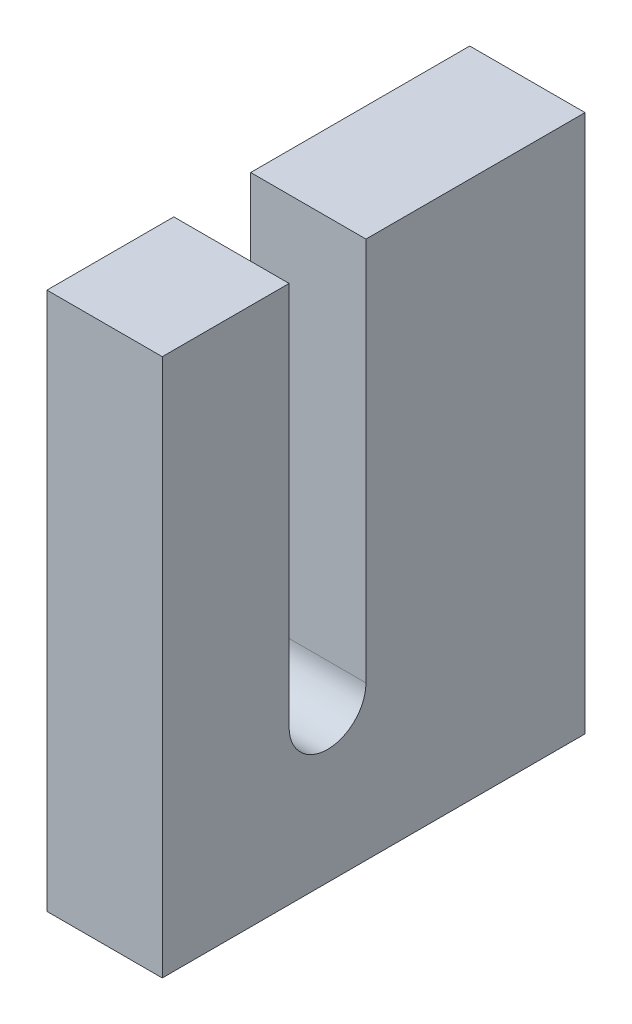
ISO-10303-21;
HEADER;
FILE_DESCRIPTION(('STEP AP214'),'2;1');
FILE_NAME('part.step','',(''),(''),'','','');
FILE_SCHEMA(('AUTOMOTIVE_DESIGN { 1 0 10303 214 1 1 1 1 }'));
ENDSEC;
DATA;
#1=APPLICATION_CONTEXT('core data for automotive mechanical design processes');
#2=APPLICATION_PROTOCOL_DEFINITION('international standard','automotive_design',2000,#1);
#3=PRODUCT_CONTEXT('',#1,'mechanical');
#4=PRODUCT('Part','Part','',(#3));
#5=PRODUCT_RELATED_PRODUCT_CATEGORY('part','',(#4));
#6=PRODUCT_DEFINITION_FORMATION('','',#4);
#7=PRODUCT_DEFINITION_CONTEXT('part definition',#1,'design');
#8=PRODUCT_DEFINITION('design','',#6,#7);
#9=PRODUCT_DEFINITION_SHAPE('','',#8);
#10=(LENGTH_UNIT() NAMED_UNIT(*) SI_UNIT(.MILLI.,.METRE.));
#11=(NAMED_UNIT(*) PLANE_ANGLE_UNIT() SI_UNIT($,.RADIAN.));
#12=(NAMED_UNIT(*) SI_UNIT($,.STERADIAN.) SOLID_ANGLE_UNIT());
#13=UNCERTAINTY_MEASURE_WITH_UNIT(LENGTH_MEASURE(1.E-05),#10,'distance_accuracy_value','');
#14=(GEOMETRIC_REPRESENTATION_CONTEXT(3) GLOBAL_UNCERTAINTY_ASSIGNED_CONTEXT((#13)) GLOBAL_UNIT_ASSIGNED_CONTEXT((#10,
#11,#12)) REPRESENTATION_CONTEXT('',''));
#15=CARTESIAN_POINT('',(0.,0.,0.));
#16=DIRECTION('',(0.,0.,1.));
#17=DIRECTION('',(1.,0.,0.));
#18=AXIS2_PLACEMENT_3D('',#15,#16,#17);
#19=CARTESIAN_POINT('',(7.5,70.,27.5));
#20=DIRECTION('',(-1.,0.,0.));
#21=DIRECTION('',(0.,0.,1.));
#22=AXIS2_PLACEMENT_3D('',#19,#20,#21);
#23=PLANE('',#22);
#24=DIRECTION('',(0.,1.,0.));
#25=VECTOR('',#24,1.);
#26=CARTESIAN_POINT('',(7.5,70.,1.00000000000001));
#27=LINE('',#26,#25);
#28=CARTESIAN_POINT('',(7.50000000000001,20.,1.00000000000001));
#29=VERTEX_POINT('',#28);
#30=CARTESIAN_POINT('',(7.50000000000001,70.,1.00000000000001));
#31=VERTEX_POINT('',#30);
#32=EDGE_CURVE('E132',#29,#31,#27,.T.);
#33=ORIENTED_EDGE('',*,*,#32,.F.);
#34=CARTESIAN_POINT('',(7.5,20.,6.00000000000001));
#35=DIRECTION('',(-1.,0.,0.));
#36=DIRECTION('',(0.,0.,1.));
#37=AXIS2_PLACEMENT_3D('',#34,#35,#36);
#38=CIRCLE('',#37,5.);
#39=CARTESIAN_POINT('',(7.50000000000001,20.,11.));
#40=VERTEX_POINT('',#39);
#41=EDGE_CURVE('E134',#29,#40,#38,.T.);
#42=ORIENTED_EDGE('',*,*,#41,.T.);
#43=DIRECTION('',(0.,1.,0.));
#44=VECTOR('',#43,1.);
#45=CARTESIAN_POINT('',(7.5,70.,11.));
#46=LINE('',#45,#44);
#47=CARTESIAN_POINT('',(7.50000000000001,70.,11.));
#48=VERTEX_POINT('',#47);
#49=EDGE_CURVE('E109',#40,#48,#46,.T.);
#50=ORIENTED_EDGE('',*,*,#49,.T.);
#51=DIRECTION('',(0.,0.,-1.));
#52=VECTOR('',#51,1.);
#53=CARTESIAN_POINT('',(7.5,70.,27.5));
#54=LINE('',#53,#52);
#55=CARTESIAN_POINT('',(7.5,70.,27.5));
#56=VERTEX_POINT('',#55);
#57=EDGE_CURVE('E137',#56,#48,#54,.T.);
#58=ORIENTED_EDGE('',*,*,#57,.F.);
#59=DIRECTION('',(0.,-1.,0.));
#60=VECTOR('',#59,1.);
#61=CARTESIAN_POINT('',(7.5,70.,27.5));
#62=LINE('',#61,#60);
#63=CARTESIAN_POINT('',(7.5,0.,27.5));
#64=VERTEX_POINT('',#63);
#65=EDGE_CURVE('E145',#56,#64,#62,.T.);
#66=ORIENTED_EDGE('',*,*,#65,.T.);
#67=DIRECTION('',(0.,0.,-1.));
#68=VECTOR('',#67,1.);
#69=CARTESIAN_POINT('',(7.5,0.,27.5));
#70=LINE('',#69,#68);
#71=CARTESIAN_POINT('',(7.50000000000001,0.,-27.5));
#72=VERTEX_POINT('',#71);
#73=EDGE_CURVE('E136',#64,#72,#70,.T.);
#74=ORIENTED_EDGE('',*,*,#73,.T.);
#75=DIRECTION('',(0.,-1.,0.));
#76=VECTOR('',#75,1.);
#77=CARTESIAN_POINT('',(7.50000000000001,70.,-27.5));
#78=LINE('',#77,#76);
#79=CARTESIAN_POINT('',(7.50000000000001,70.,-27.5));
#80=VERTEX_POINT('',#79);
#81=EDGE_CURVE('E159',#80,#72,#78,.T.);
#82=ORIENTED_EDGE('',*,*,#81,.F.);
#83=EDGE_CURVE('E85',#31,#80,#54,.T.);
#84=ORIENTED_EDGE('',*,*,#83,.F.);
#85=EDGE_LOOP('',(#33,#42,#50,#58,#66,#74,#82,#84));
#86=FACE_BOUND('',#85,.T.);
#87=ADVANCED_FACE('F33',(#86),#23,.F.);
#88=CARTESIAN_POINT('',(-7.49999999999999,70.,27.5));
#89=DIRECTION('',(1.,0.,0.));
#90=DIRECTION('',(0.,0.,-1.));
#91=AXIS2_PLACEMENT_3D('',#88,#89,#90);
#92=PLANE('',#91);
#93=DIRECTION('',(0.,1.,0.));
#94=VECTOR('',#93,1.);
#95=CARTESIAN_POINT('',(-7.49999999999999,0.,1.00000000000001));
#96=LINE('',#95,#94);
#97=CARTESIAN_POINT('',(-7.49999999999999,20.,1.00000000000001));
#98=VERTEX_POINT('',#97);
#99=CARTESIAN_POINT('',(-7.49999999999999,70.,1.00000000000001));
#100=VERTEX_POINT('',#99);
#101=EDGE_CURVE('E113',#98,#100,#96,.T.);
#102=ORIENTED_EDGE('',*,*,#101,.T.);
#103=DIRECTION('',(0.,0.,1.));
#104=VECTOR('',#103,1.);
#105=CARTESIAN_POINT('',(-7.49999999999999,70.,27.5));
#106=LINE('',#105,#104);
#107=CARTESIAN_POINT('',(-7.49999999999999,70.,-27.5));
#108=VERTEX_POINT('',#107);
#109=EDGE_CURVE('E141',#108,#100,#106,.T.);
#110=ORIENTED_EDGE('',*,*,#109,.F.);
#111=DIRECTION('',(0.,-1.,0.));
#112=VECTOR('',#111,1.);
#113=CARTESIAN_POINT('',(-7.49999999999999,70.,-27.5));
#114=LINE('',#113,#112);
#115=CARTESIAN_POINT('',(-7.49999999999999,0.,-27.5));
#116=VERTEX_POINT('',#115);
#117=EDGE_CURVE('E156',#108,#116,#114,.T.);
#118=ORIENTED_EDGE('',*,*,#117,.T.);
#119=DIRECTION('',(0.,0.,1.));
#120=VECTOR('',#119,1.);
#121=CARTESIAN_POINT('',(-7.49999999999999,0.,27.5));
#122=LINE('',#121,#120);
#123=CARTESIAN_POINT('',(-7.49999999999999,0.,27.5));
#124=VERTEX_POINT('',#123);
#125=EDGE_CURVE('E150',#116,#124,#122,.T.);
#126=ORIENTED_EDGE('',*,*,#125,.T.);
#127=DIRECTION('',(0.,-1.,0.));
#128=VECTOR('',#127,1.);
#129=CARTESIAN_POINT('',(-7.49999999999999,70.,27.5));
#130=LINE('',#129,#128);
#131=CARTESIAN_POINT('',(-7.49999999999999,70.,27.5));
#132=VERTEX_POINT('',#131);
#133=EDGE_CURVE('E154',#132,#124,#130,.T.);
#134=ORIENTED_EDGE('',*,*,#133,.F.);
#135=CARTESIAN_POINT('',(-7.49999999999999,70.,11.));
#136=VERTEX_POINT('',#135);
#137=EDGE_CURVE('E126',#136,#132,#106,.T.);
#138=ORIENTED_EDGE('',*,*,#137,.F.);
#139=DIRECTION('',(0.,1.,0.));
#140=VECTOR('',#139,1.);
#141=CARTESIAN_POINT('',(-7.49999999999999,0.,11.));
#142=LINE('',#141,#140);
#143=CARTESIAN_POINT('',(-7.49999999999999,20.,11.));
#144=VERTEX_POINT('',#143);
#145=EDGE_CURVE('E47',#144,#136,#142,.T.);
#146=ORIENTED_EDGE('',*,*,#145,.F.);
#147=CARTESIAN_POINT('',(-7.49999999999999,20.,6.00000000000001));
#148=DIRECTION('',(-1.,0.,0.));
#149=DIRECTION('',(0.,0.,1.));
#150=AXIS2_PLACEMENT_3D('',#147,#148,#149);
#151=CIRCLE('',#150,5.);
#152=EDGE_CURVE('E116',#98,#144,#151,.T.);
#153=ORIENTED_EDGE('',*,*,#152,.F.);
#154=EDGE_LOOP('',(#102,#110,#118,#126,#134,#138,#146,#153));
#155=FACE_BOUND('',#154,.T.);
#156=ADVANCED_FACE('F124',(#155),#92,.F.);
#157=CARTESIAN_POINT('',(0.,70.,0.));
#158=DIRECTION('',(0.,-1.,0.));
#159=DIRECTION('',(0.,0.,-1.));
#160=AXIS2_PLACEMENT_3D('',#157,#158,#159);
#161=PLANE('',#160);
#162=DIRECTION('',(-1.,0.,0.));
#163=VECTOR('',#162,1.);
#164=CARTESIAN_POINT('',(0.,70.,1.00000000000001));
#165=LINE('',#164,#163);
#166=EDGE_CURVE('E11',#31,#100,#165,.T.);
#167=ORIENTED_EDGE('',*,*,#166,.F.);
#168=ORIENTED_EDGE('',*,*,#83,.T.);
#169=DIRECTION('',(-1.,0.,0.));
#170=VECTOR('',#169,1.);
#171=CARTESIAN_POINT('',(-7.49999999999999,70.,-27.5));
#172=LINE('',#171,#170);
#173=EDGE_CURVE('E139',#80,#108,#172,.T.);
#174=ORIENTED_EDGE('',*,*,#173,.T.);
#175=ORIENTED_EDGE('',*,*,#109,.T.);
#176=EDGE_LOOP('',(#167,#168,#174,#175));
#177=FACE_BOUND('',#176,.T.);
#178=ADVANCED_FACE('F168',(#177),#161,.F.);
#179=CARTESIAN_POINT('',(-7.49999999999999,70.,-27.5));
#180=DIRECTION('',(0.,0.,1.));
#181=DIRECTION('',(1.,0.,0.));
#182=AXIS2_PLACEMENT_3D('',#179,#180,#181);
#183=PLANE('',#182);
#184=DIRECTION('',(-1.,0.,0.));
#185=VECTOR('',#184,1.);
#186=CARTESIAN_POINT('',(-7.49999999999999,0.,-27.5));
#187=LINE('',#186,#185);
#188=EDGE_CURVE('E148',#72,#116,#187,.T.);
#189=ORIENTED_EDGE('',*,*,#188,.T.);
#190=ORIENTED_EDGE('',*,*,#117,.F.);
#191=ORIENTED_EDGE('',*,*,#173,.F.);
#192=ORIENTED_EDGE('',*,*,#81,.T.);
#193=EDGE_LOOP('',(#189,#190,#191,#192));
#194=FACE_BOUND('',#193,.T.);
#195=ADVANCED_FACE('F172',(#194),#183,.F.);
#196=CARTESIAN_POINT('',(-7.49999999999999,70.,27.5));
#197=DIRECTION('',(0.,0.,-1.));
#198=DIRECTION('',(-1.,0.,0.));
#199=AXIS2_PLACEMENT_3D('',#196,#197,#198);
#200=PLANE('',#199);
#201=DIRECTION('',(1.,0.,0.));
#202=VECTOR('',#201,1.);
#203=CARTESIAN_POINT('',(-7.49999999999999,0.,27.5));
#204=LINE('',#203,#202);
#205=EDGE_CURVE('E77',#124,#64,#204,.T.);
#206=ORIENTED_EDGE('',*,*,#205,.T.);
#207=ORIENTED_EDGE('',*,*,#65,.F.);
#208=DIRECTION('',(1.,0.,0.));
#209=VECTOR('',#208,1.);
#210=CARTESIAN_POINT('',(-7.49999999999999,70.,27.5));
#211=LINE('',#210,#209);
#212=EDGE_CURVE('E56',#132,#56,#211,.T.);
#213=ORIENTED_EDGE('',*,*,#212,.F.);
#214=ORIENTED_EDGE('',*,*,#133,.T.);
#215=EDGE_LOOP('',(#206,#207,#213,#214));
#216=FACE_BOUND('',#215,.T.);
#217=ADVANCED_FACE('F177',(#216),#200,.F.);
#218=ORIENTED_EDGE('',*,*,#57,.T.);
#219=DIRECTION('',(-1.,0.,0.));
#220=VECTOR('',#219,1.);
#221=CARTESIAN_POINT('',(0.,70.,11.));
#222=LINE('',#221,#220);
#223=EDGE_CURVE('E40',#48,#136,#222,.T.);
#224=ORIENTED_EDGE('',*,*,#223,.T.);
#225=ORIENTED_EDGE('',*,*,#137,.T.);
#226=ORIENTED_EDGE('',*,*,#212,.T.);
#227=EDGE_LOOP('',(#218,#224,#225,#226));
#228=FACE_BOUND('',#227,.T.);
#229=ADVANCED_FACE('F161',(#228),#161,.F.);
#230=CARTESIAN_POINT('',(0.,0.,0.));
#231=DIRECTION('',(0.,-1.,0.));
#232=DIRECTION('',(0.,0.,-1.));
#233=AXIS2_PLACEMENT_3D('',#230,#231,#232);
#234=PLANE('',#233);
#235=ORIENTED_EDGE('',*,*,#73,.F.);
#236=ORIENTED_EDGE('',*,*,#205,.F.);
#237=ORIENTED_EDGE('',*,*,#125,.F.);
#238=ORIENTED_EDGE('',*,*,#188,.F.);
#239=EDGE_LOOP('',(#235,#236,#237,#238));
#240=FACE_BOUND('',#239,.T.);
#241=ADVANCED_FACE('F176',(#240),#234,.T.);
#242=CARTESIAN_POINT('',(37.5,20.,6.00000000000001));
#243=DIRECTION('',(-1.,0.,0.));
#244=DIRECTION('',(0.,0.,1.));
#245=AXIS2_PLACEMENT_3D('',#242,#243,#244);
#246=CYLINDRICAL_SURFACE('',#245,5.);
#247=DIRECTION('',(-1.,0.,0.));
#248=VECTOR('',#247,1.);
#249=CARTESIAN_POINT('',(37.5,20.,1.00000000000001));
#250=LINE('',#249,#248);
#251=EDGE_CURVE('E112',#29,#98,#250,.T.);
#252=ORIENTED_EDGE('',*,*,#251,.T.);
#253=ORIENTED_EDGE('',*,*,#152,.T.);
#254=DIRECTION('',(-1.,0.,0.));
#255=VECTOR('',#254,1.);
#256=CARTESIAN_POINT('',(37.5,20.,11.));
#257=LINE('',#256,#255);
#258=EDGE_CURVE('E105',#40,#144,#257,.T.);
#259=ORIENTED_EDGE('',*,*,#258,.F.);
#260=ORIENTED_EDGE('',*,*,#41,.F.);
#261=EDGE_LOOP('',(#252,#253,#259,#260));
#262=FACE_BOUND('',#261,.T.);
#263=ADVANCED_FACE('F117',(#262),#246,.F.);
#264=CARTESIAN_POINT('',(37.5,0.,1.00000000000001));
#265=DIRECTION('',(0.,0.,1.));
#266=DIRECTION('',(0.,-1.,0.));
#267=AXIS2_PLACEMENT_3D('',#264,#265,#266);
#268=PLANE('',#267);
#269=ORIENTED_EDGE('',*,*,#32,.T.);
#270=ORIENTED_EDGE('',*,*,#166,.T.);
#271=ORIENTED_EDGE('',*,*,#101,.F.);
#272=ORIENTED_EDGE('',*,*,#251,.F.);
#273=EDGE_LOOP('',(#269,#270,#271,#272));
#274=FACE_BOUND('',#273,.T.);
#275=ADVANCED_FACE('F166',(#274),#268,.T.);
#276=CARTESIAN_POINT('',(37.5,0.,11.));
#277=DIRECTION('',(0.,0.,1.));
#278=DIRECTION('',(0.,-1.,0.));
#279=AXIS2_PLACEMENT_3D('',#276,#277,#278);
#280=PLANE('',#279);
#281=ORIENTED_EDGE('',*,*,#258,.T.);
#282=ORIENTED_EDGE('',*,*,#145,.T.);
#283=ORIENTED_EDGE('',*,*,#223,.F.);
#284=ORIENTED_EDGE('',*,*,#49,.F.);
#285=EDGE_LOOP('',(#281,#282,#283,#284));
#286=FACE_BOUND('',#285,.T.);
#287=ADVANCED_FACE('F107',(#286),#280,.F.);
#288=CLOSED_SHELL('',(#87,#156,#178,#195,#217,#229,#241,#263,#275,#287));
#289=MANIFOLD_SOLID_BREP('B2',#288);
#290=ADVANCED_BREP_SHAPE_REPRESENTATION('',(#18,#289),#14);
#291=SHAPE_DEFINITION_REPRESENTATION(#9,#290);
ENDSEC;
END-ISO-10303-21;
